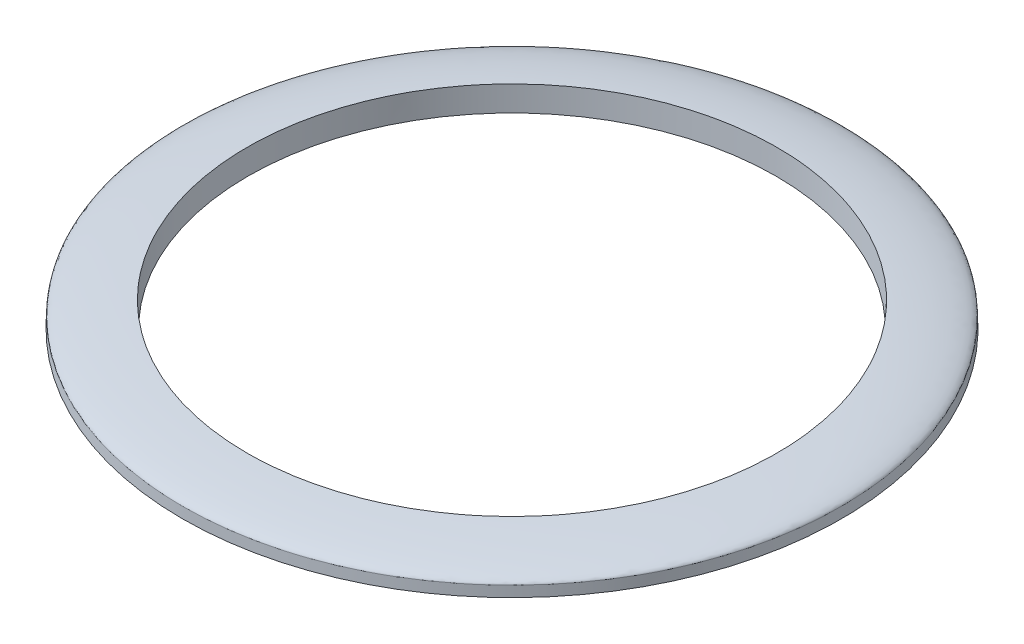
ISO-10303-21;
HEADER;
FILE_DESCRIPTION(('STEP AP214'),'2;1');
FILE_NAME('part.step','',(''),(''),'','','');
FILE_SCHEMA(('AUTOMOTIVE_DESIGN { 1 0 10303 214 1 1 1 1 }'));
ENDSEC;
DATA;
#1=APPLICATION_CONTEXT('core data for automotive mechanical design processes');
#2=APPLICATION_PROTOCOL_DEFINITION('international standard','automotive_design',2000,#1);
#3=PRODUCT_CONTEXT('',#1,'mechanical');
#4=PRODUCT('Part','Part','',(#3));
#5=PRODUCT_RELATED_PRODUCT_CATEGORY('part','',(#4));
#6=PRODUCT_DEFINITION_FORMATION('','',#4);
#7=PRODUCT_DEFINITION_CONTEXT('part definition',#1,'design');
#8=PRODUCT_DEFINITION('design','',#6,#7);
#9=PRODUCT_DEFINITION_SHAPE('','',#8);
#10=(LENGTH_UNIT() NAMED_UNIT(*) SI_UNIT(.MILLI.,.METRE.));
#11=(NAMED_UNIT(*) PLANE_ANGLE_UNIT() SI_UNIT($,.RADIAN.));
#12=(NAMED_UNIT(*) SI_UNIT($,.STERADIAN.) SOLID_ANGLE_UNIT());
#13=UNCERTAINTY_MEASURE_WITH_UNIT(LENGTH_MEASURE(1.E-05),#10,'distance_accuracy_value','');
#14=(GEOMETRIC_REPRESENTATION_CONTEXT(3) GLOBAL_UNCERTAINTY_ASSIGNED_CONTEXT((#13)) GLOBAL_UNIT_ASSIGNED_CONTEXT((#10,
#11,#12)) REPRESENTATION_CONTEXT('',''));
#15=CARTESIAN_POINT('',(0.,0.,0.));
#16=DIRECTION('',(0.,0.,1.));
#17=DIRECTION('',(1.,0.,0.));
#18=AXIS2_PLACEMENT_3D('',#15,#16,#17);
#19=CARTESIAN_POINT('',(0.,0.,0.));
#20=DIRECTION('',(0.,1.,0.));
#21=DIRECTION('',(0.,0.,1.));
#22=AXIS2_PLACEMENT_3D('',#19,#20,#21);
#23=PLANE('',#22);
#24=CARTESIAN_POINT('',(0.,0.,0.));
#25=DIRECTION('',(0.,1.,0.));
#26=DIRECTION('',(0.,0.,1.));
#27=AXIS2_PLACEMENT_3D('',#24,#25,#26);
#28=CIRCLE('',#27,20.12);
#29=CARTESIAN_POINT('',(0.,0.,20.12));
#30=VERTEX_POINT('',#29);
#31=EDGE_CURVE('E53',#30,#30,#28,.T.);
#32=ORIENTED_EDGE('',*,*,#31,.F.);
#33=EDGE_LOOP('',(#32));
#34=FACE_BOUND('',#33,.T.);
#35=CARTESIAN_POINT('',(0.,0.,0.));
#36=DIRECTION('',(0.,1.,0.));
#37=DIRECTION('',(0.,0.,1.));
#38=AXIS2_PLACEMENT_3D('',#35,#36,#37);
#39=CIRCLE('',#38,16.12);
#40=CARTESIAN_POINT('',(0.,0.,16.12));
#41=VERTEX_POINT('',#40);
#42=EDGE_CURVE('E63',#41,#41,#39,.T.);
#43=ORIENTED_EDGE('',*,*,#42,.T.);
#44=EDGE_LOOP('',(#43));
#45=FACE_BOUND('',#44,.T.);
#46=ADVANCED_FACE('F40',(#34,#45),#23,.F.);
#47=CARTESIAN_POINT('',(0.,0.,0.));
#48=DIRECTION('',(0.,-1.,0.));
#49=DIRECTION('',(0.,0.,1.));
#50=AXIS2_PLACEMENT_3D('',#47,#48,#49);
#51=CONICAL_SURFACE('',#50,20.12,0.0349065850398866);
#52=CARTESIAN_POINT('',(0.,0.642220226457298,20.097573175509));
#53=CARTESIAN_POINT('',(1.31538308755152,0.642220226457298,20.097573175509));
#54=CARTESIAN_POINT('',(2.63073365218901,0.642220226457225,19.9680224524914));
#55=CARTESIAN_POINT('',(5.21095039291647,0.642220226457371,19.4547854322406));
#56=CARTESIAN_POINT('',(6.47575277301016,0.642220226457353,19.0711118248205));
#57=CARTESIAN_POINT('',(8.90626379701449,0.642220226457244,18.0643611951806));
#58=CARTESIAN_POINT('',(10.0719123464086,0.642220226457214,17.4413090649246));
#59=CARTESIAN_POINT('',(12.2593144780834,0.642220226457383,15.9797336880004));
#60=CARTESIAN_POINT('',(13.2810139767288,0.642220226457298,15.1412465788617));
#61=CARTESIAN_POINT('',(15.1412465788617,0.642220226457298,13.2810139767288));
#62=CARTESIAN_POINT('',(15.9797336880004,0.642220226457383,12.2593144780834));
#63=CARTESIAN_POINT('',(17.4413090649246,0.642220226457214,10.0719123464086));
#64=CARTESIAN_POINT('',(18.0643611951811,0.642220226457248,8.90626379701345));
#65=CARTESIAN_POINT('',(19.0711118248201,0.642220226457348,6.47575277301118));
#66=CARTESIAN_POINT('',(19.4547854322406,0.642220226457431,5.2109503929167));
#67=CARTESIAN_POINT('',(19.9680224524914,0.642220226457165,2.63073365218881));
#68=CARTESIAN_POINT('',(20.097573175509,0.642220226457298,1.31538308755345));
#69=CARTESIAN_POINT('',(20.097573175509,0.642220226457298,-1.31538308755345));
#70=CARTESIAN_POINT('',(19.9680224524913,0.642220226457219,-2.63073365218922));
#71=CARTESIAN_POINT('',(19.4547854322407,0.642220226457377,-5.21095039291623));
#72=CARTESIAN_POINT('',(19.0711118248207,0.642220226457188,-6.47575277300977));
#73=CARTESIAN_POINT('',(18.0643611951805,0.642220226457409,-8.90626379701488));
#74=CARTESIAN_POINT('',(17.4413090649246,0.642220226457214,-10.0719123464086));
#75=CARTESIAN_POINT('',(15.9797336880004,0.642220226457383,-12.2593144780834));
#76=CARTESIAN_POINT('',(15.1412465788607,0.642220226457298,-13.2810139767297));
#77=CARTESIAN_POINT('',(13.2810139767297,0.642220226457298,-15.1412465788608));
#78=CARTESIAN_POINT('',(12.2593144780834,0.642220226457382,-15.9797336880004));
#79=CARTESIAN_POINT('',(10.0719123464087,0.642220226457214,-17.4413090649246));
#80=CARTESIAN_POINT('',(8.90626379701373,0.64222022645737,-18.0643611951809));
#81=CARTESIAN_POINT('',(6.47575277301097,0.642220226457227,-19.0711118248202));
#82=CARTESIAN_POINT('',(5.21095039291749,0.64222022645749,-19.4547854322404));
#83=CARTESIAN_POINT('',(2.63073365218802,0.642220226457106,-19.9680224524916));
#84=CARTESIAN_POINT('',(1.31538308755345,0.642220226457298,-20.097573175509));
#85=CARTESIAN_POINT('',(-1.31538308755345,0.642220226457298,-20.097573175509));
#86=CARTESIAN_POINT('',(-2.63073365218922,0.642220226457162,-19.9680224524913));
#87=CARTESIAN_POINT('',(-5.21095039291623,0.642220226457434,-19.4547854322407));
#88=CARTESIAN_POINT('',(-6.47575277301013,0.642220226457295,-19.0711118248206));
#89=CARTESIAN_POINT('',(-8.90626379701446,0.642220226457301,-18.0643611951806));
#90=CARTESIAN_POINT('',(-10.0719123464091,0.642220226457125,-17.4413090649243));
#91=CARTESIAN_POINT('',(-12.259314478083,0.642220226457471,-15.9797336880006));
#92=CARTESIAN_POINT('',(-13.2810139767279,0.642220226457481,-15.1412465788626));
#93=CARTESIAN_POINT('',(-15.1412465788626,0.642220226457115,-13.2810139767279));
#94=CARTESIAN_POINT('',(-15.979733688001,0.642220226457286,-12.2593144780824));
#95=CARTESIAN_POINT('',(-17.4413090649239,0.64222022645731,-10.0719123464097));
#96=CARTESIAN_POINT('',(-18.0643611951809,0.642220226457297,-8.90626379701385));
#97=CARTESIAN_POINT('',(-19.0711118248203,0.642220226457299,-6.47575277301084));
#98=CARTESIAN_POINT('',(-19.4547854322404,0.642220226457424,-5.21095039291767));
#99=CARTESIAN_POINT('',(-19.9680224524916,0.642220226457172,-2.63073365218786));
#100=CARTESIAN_POINT('',(-20.097573175509,0.642220226457298,-1.31538308755342));
#101=CARTESIAN_POINT('',(-20.0975731755089,0.642220226457298,1.31538308755348));
#102=CARTESIAN_POINT('',(-19.9680224524914,0.642220226457166,2.6307336521887));
#103=CARTESIAN_POINT('',(-19.4547854322406,0.64222022645743,5.21095039291675));
#104=CARTESIAN_POINT('',(-19.071111824821,0.642220226457373,6.47575277300897));
#105=CARTESIAN_POINT('',(-18.0643611951802,0.642220226457224,8.90626379701561));
#106=CARTESIAN_POINT('',(-17.4413090649249,0.64222022645716,10.0719123464082));
#107=CARTESIAN_POINT('',(-15.9797336880001,0.642220226457436,12.2593144780838));
#108=CARTESIAN_POINT('',(-15.141246578862,0.642220226457184,13.2810139767285));
#109=CARTESIAN_POINT('',(-13.2810139767286,0.642220226457412,15.1412465788619));
#110=CARTESIAN_POINT('',(-12.2593144780824,0.642220226457229,15.979733688001));
#111=CARTESIAN_POINT('',(-10.0719123464097,0.642220226457367,17.4413090649239));
#112=CARTESIAN_POINT('',(-8.90626379701346,0.642220226457303,18.0643611951811));
#113=CARTESIAN_POINT('',(-6.47575277301124,0.642220226457293,19.0711118248201));
#114=CARTESIAN_POINT('',(-5.21095039291724,0.642220226457427,19.4547854322405));
#115=CARTESIAN_POINT('',(-2.6307336521883,0.642220226457169,19.9680224524915));
#116=CARTESIAN_POINT('',(-1.31538308755153,0.642220226457298,20.097573175509));
#117=CARTESIAN_POINT('',(0.,0.642220226457298,20.097573175509));
#118=(BOUNDED_CURVE() B_SPLINE_CURVE(3,(#52,#53,#54,#55,#56,#57,#58,#59,#60,#61,#62,#63,#64,#65,
#66,#67,#68,#69,#70,#71,#72,#73,#74,#75,#76,#77,#78,#79,#80,#81,#82,#83,#84,#85,#86,#87,#88,#89,
#90,#91,#92,#93,#94,#95,#96,#97,#98,#99,#100,#101,#102,#103,#104,#105,#106,#107,#108,#109,#110,
#111,#112,#113,#114,#115,#116,#117),.UNSPECIFIED.,.T.,.F.) B_SPLINE_CURVE_WITH_KNOTS((4,2,2,2,2,
2,2,2,2,2,2,2,2,2,2,2,2,2,2,2,2,2,2,2,2,2,2,2,2,2,2,2,4),(0.,0.196349540849362,
0.392699081698724,0.589048622548086,0.785398163397448,0.98174770424681,1.17809724509617,
1.37444678594553,1.5707963267949,1.76714586764426,1.96349540849362,2.15984494934298,
2.35619449019234,2.55254403104171,2.74889357189107,2.94524311274043,3.14159265358979,
3.33794219443916,3.53429173528852,3.73064127613788,3.92699081698724,4.1233403578366,
4.31968989868597,4.51603943953533,4.71238898038469,4.90873852123405,5.10508806208341,
5.30143760293278,5.49778714378214,5.6941366846315,5.89048622548086,6.08683576633022,
6.28318530717959),
.UNSPECIFIED.) CURVE() GEOMETRIC_REPRESENTATION_ITEM() RATIONAL_B_SPLINE_CURVE((1.,1.,1.,1.,1.,
1.,1.,1.,1.,1.,1.,1.,1.,1.,1.,1.,1.,1.,1.,1.,1.,1.,1.,1.,1.,1.,1.,1.,1.,1.,1.,1.,1.,1.,1.,1.,1.,
1.,1.,1.,1.,1.,1.,1.,1.,1.,1.,1.,1.,1.,1.,1.,1.,1.,1.,1.,1.,1.,1.,1.,1.,1.,1.,1.,1.,1.)) REPRESENTATION_ITEM(''));
#119=CARTESIAN_POINT('',(0.,0.642220226457298,20.097573175509));
#120=VERTEX_POINT('',#119);
#121=EDGE_CURVE('E11',#120,#120,#118,.F.);
#122=ORIENTED_EDGE('',*,*,#121,.T.);
#123=EDGE_LOOP('',(#122));
#124=FACE_BOUND('',#123,.T.);
#125=ORIENTED_EDGE('',*,*,#31,.T.);
#126=EDGE_LOOP('',(#125));
#127=FACE_BOUND('',#126,.T.);
#128=ADVANCED_FACE('F72',(#124,#127),#51,.T.);
#129=CARTESIAN_POINT('',(0.,0.,0.));
#130=DIRECTION('',(0.,1.,0.));
#131=DIRECTION('',(0.,0.,1.));
#132=AXIS2_PLACEMENT_3D('',#129,#130,#131);
#133=CONICAL_SURFACE('',#132,16.12,0.0349065850398866);
#134=CARTESIAN_POINT('',(0.,1.5,16.1723811542376));
#135=CARTESIAN_POINT('',(-1.05847987067635,1.5,16.1723811542376));
#136=CARTESIAN_POINT('',(-2.11693357038287,1.5,16.068132563965));
#137=CARTESIAN_POINT('',(-4.19321652391273,1.5,15.6551342063287));
#138=CARTESIAN_POINT('',(-5.21099444152664,1.49999999999977,15.3463946503722));
#139=CARTESIAN_POINT('',(-7.16681021771369,1.50000000000023,14.5362692303706));
#140=CARTESIAN_POINT('',(-8.10479971863917,1.50000000000023,14.0349033967212));
#141=CARTESIAN_POINT('',(-9.86498741404409,1.49999999999977,12.8587835799247));
#142=CARTESIAN_POINT('',(-10.6871420877892,1.50000000000023,12.1840586763998));
#143=CARTESIAN_POINT('',(-12.1840586764008,1.49999999999977,10.68714208779));
#144=CARTESIAN_POINT('',(-12.8587835799229,1.50000000000011,9.86498741404407));
#145=CARTESIAN_POINT('',(-14.034903396723,1.49999999999989,8.10479971863915));
#146=CARTESIAN_POINT('',(-14.5362692303697,1.5,7.16681021771455));
#147=CARTESIAN_POINT('',(-15.3463946503731,1.5,5.21099444152568));
#148=CARTESIAN_POINT('',(-15.6551342063288,1.5,4.19321652391201));
#149=CARTESIAN_POINT('',(-16.068132563965,1.5,2.11693357038352));
#150=CARTESIAN_POINT('',(-16.1723811542376,1.5,1.05847987067792));
#151=CARTESIAN_POINT('',(-16.1723811542376,1.5,-1.05847987067787));
#152=CARTESIAN_POINT('',(-16.068132563965,1.5,-2.11693357038264));
#153=CARTESIAN_POINT('',(-15.6551342063287,1.5,-4.19321652391296));
#154=CARTESIAN_POINT('',(-15.3463946503722,1.49999999999977,-5.21099444152619));
#155=CARTESIAN_POINT('',(-14.5362692303706,1.50000000000023,-7.16681021771414));
#156=CARTESIAN_POINT('',(-14.0349033967221,1.49999999999989,-8.104799718641));
#157=CARTESIAN_POINT('',(-12.8587835799238,1.50000000000011,-9.86498741404227));
#158=CARTESIAN_POINT('',(-12.1840586764009,1.49999999999966,-10.6871420877899));
#159=CARTESIAN_POINT('',(-10.687142087789,1.50000000000034,-12.1840586764));
#160=CARTESIAN_POINT('',(-9.86498741404326,1.50000000000011,-12.8587835799234));
#161=CARTESIAN_POINT('',(-8.10479971863996,1.49999999999989,-14.0349033967225));
#162=CARTESIAN_POINT('',(-7.16681021771442,1.5,-14.5362692303717));
#163=CARTESIAN_POINT('',(-5.21099444152583,1.5,-15.3463946503711));
#164=CARTESIAN_POINT('',(-4.19321652391144,1.50000000000023,-15.6551342063266));
#165=CARTESIAN_POINT('',(-2.11693357038409,1.49999999999977,-16.0681325639672));
#166=CARTESIAN_POINT('',(-1.0584798706779,1.5,-16.1723811542376));
#167=CARTESIAN_POINT('',(1.0584798706779,1.5,-16.1723811542376));
#168=CARTESIAN_POINT('',(2.11693357038321,1.5,-16.0681325639653));
#169=CARTESIAN_POINT('',(4.19321652391238,1.5,-15.6551342063284));
#170=CARTESIAN_POINT('',(5.21099444152587,1.50000000000011,-15.3463946503702));
#171=CARTESIAN_POINT('',(7.16681021771446,1.49999999999989,-14.5362692303726));
#172=CARTESIAN_POINT('',(8.10479971863998,1.49999999999989,-14.0349033967215));
#173=CARTESIAN_POINT('',(9.86498741404328,1.50000000000011,-12.8587835799243));
#174=CARTESIAN_POINT('',(10.6871420877899,1.5,-12.1840586764));
#175=CARTESIAN_POINT('',(12.1840586764,1.5,-10.6871420877899));
#176=CARTESIAN_POINT('',(12.8587835799243,1.50000000000011,-9.86498741404418));
#177=CARTESIAN_POINT('',(14.0349033967216,1.49999999999989,-8.10479971863904));
#178=CARTESIAN_POINT('',(14.5362692303717,1.50000000000011,-7.16681021771491));
#179=CARTESIAN_POINT('',(15.3463946503711,1.49999999999989,-5.2109944415254));
#180=CARTESIAN_POINT('',(15.6551342063284,1.50000000000011,-4.1932165239119));
#181=CARTESIAN_POINT('',(16.0681325639653,1.49999999999989,-2.11693357038364));
#182=CARTESIAN_POINT('',(16.1723811542376,1.5,-1.0584798706779));
#183=CARTESIAN_POINT('',(16.1723811542376,1.5,1.0584798706779));
#184=CARTESIAN_POINT('',(16.0681325639653,1.49999999999989,2.11693357038366));
#185=CARTESIAN_POINT('',(15.6551342063284,1.50000000000011,4.19321652391192));
#186=CARTESIAN_POINT('',(15.3463946503711,1.5,5.21099444152584));
#187=CARTESIAN_POINT('',(14.5362692303717,1.5,7.16681021771444));
#188=CARTESIAN_POINT('',(14.0349033967234,1.49999999999977,8.10479971863996));
#189=CARTESIAN_POINT('',(12.8587835799225,1.50000000000023,9.86498741404327));
#190=CARTESIAN_POINT('',(12.1840586764,1.5,10.6871420877899));
#191=CARTESIAN_POINT('',(10.6871420877899,1.5,12.1840586764));
#192=CARTESIAN_POINT('',(9.86498741404419,1.50000000000011,12.8587835799243));
#193=CARTESIAN_POINT('',(8.10479971863905,1.49999999999989,14.0349033967215));
#194=CARTESIAN_POINT('',(7.1668102177149,1.5,14.5362692303708));
#195=CARTESIAN_POINT('',(5.21099444152539,1.5,15.346394650372));
#196=CARTESIAN_POINT('',(4.19321652391192,1.50000000000011,15.6551342063283));
#197=CARTESIAN_POINT('',(2.11693357038364,1.49999999999989,16.0681325639654));
#198=CARTESIAN_POINT('',(1.05847987067635,1.5,16.1723811542376));
#199=CARTESIAN_POINT('',(0.,1.5,16.1723811542376));
#200=(BOUNDED_CURVE() B_SPLINE_CURVE(3,(#134,#135,#136,#137,#138,#139,#140,#141,#142,#143,#144,
#145,#146,#147,#148,#149,#150,#151,#152,#153,#154,#155,#156,#157,#158,#159,#160,#161,#162,#163,
#164,#165,#166,#167,#168,#169,#170,#171,#172,#173,#174,#175,#176,#177,#178,#179,#180,#181,#182,
#183,#184,#185,#186,#187,#188,#189,#190,#191,#192,#193,#194,#195,#196,#197,#198,#199),
.UNSPECIFIED.,.T.,.F.) B_SPLINE_CURVE_WITH_KNOTS((4,2,2,2,2,2,2,2,2,2,2,2,2,2,2,2,2,2,2,2,2,2,2,
2,2,2,2,2,2,2,2,2,4),(0.,0.196349540849362,0.392699081698725,0.589048622548086,
0.785398163397448,0.981747704246811,1.17809724509617,1.37444678594553,1.5707963267949,
1.76714586764426,1.96349540849362,2.15984494934298,2.35619449019234,2.55254403104171,
2.74889357189107,2.94524311274043,3.14159265358979,3.33794219443916,3.53429173528852,
3.73064127613788,3.92699081698724,4.1233403578366,4.31968989868597,4.51603943953533,
4.71238898038469,4.90873852123405,5.10508806208341,5.30143760293278,5.49778714378214,
5.6941366846315,5.89048622548086,6.08683576633022,6.28318530717959),
.UNSPECIFIED.) CURVE() GEOMETRIC_REPRESENTATION_ITEM() RATIONAL_B_SPLINE_CURVE((1.,1.,1.,1.,1.,
1.,1.,1.,1.,1.,1.,1.,1.,1.,1.,1.,1.,1.,1.,1.,1.,1.,1.,1.,1.,1.,1.,1.,1.,1.,1.,1.,1.,1.,1.,1.,1.,
1.,1.,1.,1.,1.,1.,1.,1.,1.,1.,1.,1.,1.,1.,1.,1.,1.,1.,1.,1.,1.,1.,1.,1.,1.,1.,1.,1.,1.)) REPRESENTATION_ITEM(''));
#201=CARTESIAN_POINT('',(0.,1.5,16.1723811542376));
#202=VERTEX_POINT('',#201);
#203=EDGE_CURVE('E58',#202,#202,#200,.F.);
#204=ORIENTED_EDGE('',*,*,#203,.T.);
#205=EDGE_LOOP('',(#204));
#206=FACE_BOUND('',#205,.T.);
#207=ORIENTED_EDGE('',*,*,#42,.F.);
#208=EDGE_LOOP('',(#207));
#209=FACE_BOUND('',#208,.T.);
#210=ADVANCED_FACE('F81',(#206,#209),#133,.F.);
#211=CARTESIAN_POINT('',(0.,1.5,16.1723811542376));
#212=CARTESIAN_POINT('',(1.05847987067635,1.5,16.1723811542376));
#213=CARTESIAN_POINT('',(2.11693357038364,1.49999999999989,16.0681325639654));
#214=CARTESIAN_POINT('',(4.19321652391192,1.50000000000011,15.6551342063283));
#215=CARTESIAN_POINT('',(5.21099444152539,1.5,15.346394650372));
#216=CARTESIAN_POINT('',(7.1668102177149,1.5,14.5362692303708));
#217=CARTESIAN_POINT('',(8.10479971863905,1.49999999999989,14.0349033967215));
#218=CARTESIAN_POINT('',(9.86498741404419,1.50000000000011,12.8587835799243));
#219=CARTESIAN_POINT('',(10.6871420877899,1.5,12.1840586764));
#220=CARTESIAN_POINT('',(12.1840586764,1.5,10.6871420877899));
#221=CARTESIAN_POINT('',(12.8587835799225,1.50000000000023,9.86498741404327));
#222=CARTESIAN_POINT('',(14.0349033967234,1.49999999999977,8.10479971863996));
#223=CARTESIAN_POINT('',(14.5362692303717,1.5,7.16681021771444));
#224=CARTESIAN_POINT('',(15.3463946503711,1.5,5.21099444152584));
#225=CARTESIAN_POINT('',(15.6551342063284,1.50000000000011,4.19321652391192));
#226=CARTESIAN_POINT('',(16.0681325639653,1.49999999999989,2.11693357038366));
#227=CARTESIAN_POINT('',(16.1723811542376,1.5,1.0584798706779));
#228=CARTESIAN_POINT('',(16.1723811542376,1.5,-1.0584798706779));
#229=CARTESIAN_POINT('',(16.0681325639653,1.49999999999989,-2.11693357038364));
#230=CARTESIAN_POINT('',(15.6551342063284,1.50000000000011,-4.1932165239119));
#231=CARTESIAN_POINT('',(15.3463946503711,1.49999999999989,-5.2109944415254));
#232=CARTESIAN_POINT('',(14.5362692303717,1.50000000000011,-7.16681021771491));
#233=CARTESIAN_POINT('',(14.0349033967216,1.49999999999989,-8.10479971863904));
#234=CARTESIAN_POINT('',(12.8587835799243,1.50000000000011,-9.86498741404418));
#235=CARTESIAN_POINT('',(12.1840586764,1.5,-10.6871420877899));
#236=CARTESIAN_POINT('',(10.6871420877899,1.5,-12.1840586764));
#237=CARTESIAN_POINT('',(9.86498741404328,1.50000000000011,-12.8587835799243));
#238=CARTESIAN_POINT('',(8.10479971863998,1.49999999999989,-14.0349033967215));
#239=CARTESIAN_POINT('',(7.16681021771446,1.49999999999989,-14.5362692303726));
#240=CARTESIAN_POINT('',(5.21099444152587,1.50000000000011,-15.3463946503702));
#241=CARTESIAN_POINT('',(4.19321652391238,1.5,-15.6551342063284));
#242=CARTESIAN_POINT('',(2.11693357038321,1.5,-16.0681325639653));
#243=CARTESIAN_POINT('',(1.0584798706779,1.5,-16.1723811542376));
#244=CARTESIAN_POINT('',(-1.0584798706779,1.5,-16.1723811542376));
#245=CARTESIAN_POINT('',(-2.11693357038409,1.49999999999977,-16.0681325639672));
#246=CARTESIAN_POINT('',(-4.19321652391144,1.50000000000023,-15.6551342063266));
#247=CARTESIAN_POINT('',(-5.21099444152583,1.5,-15.3463946503711));
#248=CARTESIAN_POINT('',(-7.16681021771442,1.5,-14.5362692303717));
#249=CARTESIAN_POINT('',(-8.10479971863996,1.49999999999989,-14.0349033967225));
#250=CARTESIAN_POINT('',(-9.86498741404326,1.50000000000011,-12.8587835799234));
#251=CARTESIAN_POINT('',(-10.687142087789,1.50000000000034,-12.1840586764));
#252=CARTESIAN_POINT('',(-12.1840586764009,1.49999999999966,-10.6871420877899));
#253=CARTESIAN_POINT('',(-12.8587835799238,1.50000000000011,-9.86498741404227));
#254=CARTESIAN_POINT('',(-14.0349033967221,1.49999999999989,-8.104799718641));
#255=CARTESIAN_POINT('',(-14.5362692303706,1.50000000000023,-7.16681021771414));
#256=CARTESIAN_POINT('',(-15.3463946503722,1.49999999999977,-5.21099444152619));
#257=CARTESIAN_POINT('',(-15.6551342063287,1.5,-4.19321652391296));
#258=CARTESIAN_POINT('',(-16.068132563965,1.5,-2.11693357038264));
#259=CARTESIAN_POINT('',(-16.1723811542376,1.5,-1.05847987067787));
#260=CARTESIAN_POINT('',(-16.1723811542376,1.5,1.05847987067792));
#261=CARTESIAN_POINT('',(-16.068132563965,1.5,2.11693357038352));
#262=CARTESIAN_POINT('',(-15.6551342063288,1.5,4.19321652391201));
#263=CARTESIAN_POINT('',(-15.3463946503731,1.5,5.21099444152568));
#264=CARTESIAN_POINT('',(-14.5362692303697,1.5,7.16681021771455));
#265=CARTESIAN_POINT('',(-14.034903396723,1.49999999999989,8.10479971863915));
#266=CARTESIAN_POINT('',(-12.8587835799229,1.50000000000011,9.86498741404407));
#267=CARTESIAN_POINT('',(-12.1840586764008,1.49999999999977,10.68714208779));
#268=CARTESIAN_POINT('',(-10.6871420877892,1.50000000000023,12.1840586763998));
#269=CARTESIAN_POINT('',(-9.86498741404409,1.49999999999977,12.8587835799247));
#270=CARTESIAN_POINT('',(-8.10479971863917,1.50000000000023,14.0349033967212));
#271=CARTESIAN_POINT('',(-7.16681021771369,1.50000000000023,14.5362692303706));
#272=CARTESIAN_POINT('',(-5.21099444152664,1.49999999999977,15.3463946503722));
#273=CARTESIAN_POINT('',(-4.19321652391273,1.5,15.6551342063287));
#274=CARTESIAN_POINT('',(-2.11693357038287,1.5,16.068132563965));
#275=CARTESIAN_POINT('',(-1.05847987067635,1.5,16.1723811542376));
#276=CARTESIAN_POINT('',(0.,1.5,16.1723811542376));
#277=CARTESIAN_POINT('',(0.,1.21663746026411,20.0775140836951));
#278=CARTESIAN_POINT('',(1.3140702230632,1.21663746026411,20.0775140836951));
#279=CARTESIAN_POINT('',(2.62810795567249,1.21663746026102,19.9480926633463));
#280=CARTESIAN_POINT('',(5.20574942007036,1.21663746026719,19.4353678974071));
#281=CARTESIAN_POINT('',(6.46928941953473,1.21663746026344,19.0520772289634));
#282=CARTESIAN_POINT('',(8.89737458627901,1.21663746026481,18.0463314223026));
#283=CARTESIAN_POINT('',(10.0618597190219,1.21663746026161,17.4239011511995));
#284=CARTESIAN_POINT('',(12.2470786368438,1.21663746026663,15.9637845511382));
#285=CARTESIAN_POINT('',(13.2677583922657,1.21663746026412,15.1261343236328));
#286=CARTESIAN_POINT('',(15.1261343236328,1.21663746026412,13.2677583922657));
#287=CARTESIAN_POINT('',(15.9637845511364,1.21663746027166,12.2470786368429));
#288=CARTESIAN_POINT('',(17.4239011512013,1.21663746025658,10.0618597190228));
#289=CARTESIAN_POINT('',(18.0463314223044,1.21663746026458,8.897374586279));
#290=CARTESIAN_POINT('',(19.0520772289616,1.21663746026366,6.46928941953473));
#291=CARTESIAN_POINT('',(19.4353678974054,1.21663746026707,5.20574942007025));
#292=CARTESIAN_POINT('',(19.948092663348,1.21663746026113,2.62810795567263));
#293=CARTESIAN_POINT('',(20.0775140836951,1.21663746026411,1.31407022306513));
#294=CARTESIAN_POINT('',(20.0775140836951,1.21663746026411,-1.31407022306512));
#295=CARTESIAN_POINT('',(19.948092663348,1.21663746026092,-2.62810795567306));
#296=CARTESIAN_POINT('',(19.4353678974054,1.21663746026731,-5.20574942006977));
#297=CARTESIAN_POINT('',(19.0520772289634,1.21663746026332,-6.46928941953383));
#298=CARTESIAN_POINT('',(18.0463314223026,1.21663746026492,-8.89737458627992));
#299=CARTESIAN_POINT('',(17.4239011512013,1.21663746026161,-10.0618597190219));
#300=CARTESIAN_POINT('',(15.9637845511364,1.21663746026663,-12.2470786368438));
#301=CARTESIAN_POINT('',(15.1261343236318,1.21663746026412,-13.2677583922666));
#302=CARTESIAN_POINT('',(13.2677583922666,1.21663746026412,-15.1261343236319));
#303=CARTESIAN_POINT('',(12.2470786368438,1.21663746026662,-15.9637845511382));
#304=CARTESIAN_POINT('',(10.0618597190219,1.21663746026159,-17.4239011511995));
#305=CARTESIAN_POINT('',(8.89737458627857,1.21663746025681,-18.0463314223026));
#306=CARTESIAN_POINT('',(6.46928941953522,1.21663746027143,-19.0520772289634));
#307=CARTESIAN_POINT('',(5.20574942007025,1.21663746025999,-19.4353678974036));
#308=CARTESIAN_POINT('',(2.62810795567263,1.21663746026821,-19.9480926633498));
#309=CARTESIAN_POINT('',(1.31407022306513,1.21663746026411,-20.0775140836951));
#310=CARTESIAN_POINT('',(-1.31407022306512,1.21663746026411,-20.0775140836951));
#311=CARTESIAN_POINT('',(-2.62810795567305,1.2166374602536,-19.948092663348));
#312=CARTESIAN_POINT('',(-5.20574942006976,1.21663746027462,-19.4353678974054));
#313=CARTESIAN_POINT('',(-6.46928941953471,1.21663746026344,-19.0520772289634));
#314=CARTESIAN_POINT('',(-8.89737458627898,1.21663746026481,-18.0463314223026));
#315=CARTESIAN_POINT('',(-10.0618597190237,1.21663746026161,-17.4239011512031));
#316=CARTESIAN_POINT('',(-12.2470786368419,1.21663746026663,-15.9637845511346));
#317=CARTESIAN_POINT('',(-13.2677583922648,1.21663746027189,-15.1261343236346));
#318=CARTESIAN_POINT('',(-15.1261343236337,1.21663746025635,-13.2677583922638));
#319=CARTESIAN_POINT('',(-15.9637845511385,1.21663746027153,-12.2470786368416));
#320=CARTESIAN_POINT('',(-17.4239011511992,1.21663746025668,-10.0618597190241));
#321=CARTESIAN_POINT('',(-18.0463314223027,1.21663746027303,-8.89737458627948));
#322=CARTESIAN_POINT('',(-19.0520772289633,1.21663746025521,-6.4692894195343));
#323=CARTESIAN_POINT('',(-19.4353678974054,1.21663746025966,-5.20574942007125));
#324=CARTESIAN_POINT('',(-19.948092663348,1.21663746026857,-2.62810795567165));
#325=CARTESIAN_POINT('',(-20.0775140836951,1.21663746026411,-1.31407022306509));
#326=CARTESIAN_POINT('',(-20.0775140836951,1.21663746026411,1.31407022306516));
#327=CARTESIAN_POINT('',(-19.948092663348,1.21663746026857,2.62810795567252));
#328=CARTESIAN_POINT('',(-19.4353678974054,1.21663746025966,5.2057494200703));
#329=CARTESIAN_POINT('',(-19.0520772289634,1.21663746025567,6.46928941953334));
#330=CARTESIAN_POINT('',(-18.0463314223027,1.21663746027258,8.89737458628034));
#331=CARTESIAN_POINT('',(-17.4239011512029,1.21663746026161,10.0618597190232));
#332=CARTESIAN_POINT('',(-15.9637845511348,1.21663746026663,12.2470786368425));
#333=CARTESIAN_POINT('',(-15.126134323634,1.21663746025624,13.2677583922654));
#334=CARTESIAN_POINT('',(-13.2677583922645,1.216637460272,15.126134323633));
#335=CARTESIAN_POINT('',(-12.2470786368416,1.21663746026149,15.9637845511367));
#336=CARTESIAN_POINT('',(-10.0618597190241,1.21663746026675,17.423901151201));
#337=CARTESIAN_POINT('',(-8.89737458627857,1.21663746027292,18.0463314223027));
#338=CARTESIAN_POINT('',(-6.46928941953522,1.21663746025532,19.0520772289633));
#339=CARTESIAN_POINT('',(-5.20574942007034,1.21663746025966,19.4353678974054));
#340=CARTESIAN_POINT('',(-2.62810795567256,1.21663746026857,19.948092663348));
#341=CARTESIAN_POINT('',(-1.3140702230632,1.21663746026411,20.0775140836951));
#342=CARTESIAN_POINT('',(0.,1.21663746026411,20.0775140836951));
#343=CARTESIAN_POINT('',(0.,0.642220226457298,20.0975731755089));
#344=CARTESIAN_POINT('',(1.31538308755152,0.642220226457298,20.0975731755089));
#345=CARTESIAN_POINT('',(2.63073365218901,0.642220226457224,19.9680224524914));
#346=CARTESIAN_POINT('',(5.21095039291647,0.642220226457371,19.4547854322406));
#347=CARTESIAN_POINT('',(6.47575277301016,0.642220226457352,19.0711118248205));
#348=CARTESIAN_POINT('',(8.90626379701449,0.642220226457243,18.0643611951806));
#349=CARTESIAN_POINT('',(10.0719123464086,0.642220226457214,17.4413090649246));
#350=CARTESIAN_POINT('',(12.2593144780834,0.642220226457382,15.9797336880004));
#351=CARTESIAN_POINT('',(13.2810139767288,0.642220226457298,15.1412465788617));
#352=CARTESIAN_POINT('',(15.1412465788617,0.642220226457298,13.2810139767288));
#353=CARTESIAN_POINT('',(15.9797336880004,0.642220226457382,12.2593144780834));
#354=CARTESIAN_POINT('',(17.4413090649246,0.642220226457214,10.0719123464086));
#355=CARTESIAN_POINT('',(18.0643611951811,0.642220226457247,8.90626379701345));
#356=CARTESIAN_POINT('',(19.0711118248201,0.642220226457348,6.47575277301118));
#357=CARTESIAN_POINT('',(19.4547854322406,0.64222022645743,5.2109503929167));
#358=CARTESIAN_POINT('',(19.9680224524914,0.642220226457165,2.63073365218881));
#359=CARTESIAN_POINT('',(20.0975731755089,0.642220226457298,1.31538308755345));
#360=CARTESIAN_POINT('',(20.0975731755089,0.642220226457298,-1.31538308755345));
#361=CARTESIAN_POINT('',(19.9680224524913,0.642220226457219,-2.63073365218922));
#362=CARTESIAN_POINT('',(19.4547854322407,0.642220226457376,-5.21095039291623));
#363=CARTESIAN_POINT('',(19.0711118248207,0.642220226457187,-6.47575277300977));
#364=CARTESIAN_POINT('',(18.0643611951805,0.642220226457408,-8.90626379701488));
#365=CARTESIAN_POINT('',(17.4413090649246,0.642220226457214,-10.0719123464086));
#366=CARTESIAN_POINT('',(15.9797336880004,0.642220226457382,-12.2593144780834));
#367=CARTESIAN_POINT('',(15.1412465788607,0.642220226457298,-13.2810139767297));
#368=CARTESIAN_POINT('',(13.2810139767297,0.642220226457298,-15.1412465788608));
#369=CARTESIAN_POINT('',(12.2593144780834,0.642220226457382,-15.9797336880003));
#370=CARTESIAN_POINT('',(10.0719123464087,0.642220226457214,-17.4413090649246));
#371=CARTESIAN_POINT('',(8.90626379701373,0.64222022645737,-18.0643611951809));
#372=CARTESIAN_POINT('',(6.47575277301097,0.642220226457226,-19.0711118248202));
#373=CARTESIAN_POINT('',(5.21095039291749,0.64222022645749,-19.4547854322404));
#374=CARTESIAN_POINT('',(2.63073365218802,0.642220226457106,-19.9680224524916));
#375=CARTESIAN_POINT('',(1.31538308755345,0.642220226457298,-20.0975731755089));
#376=CARTESIAN_POINT('',(-1.31538308755345,0.642220226457298,-20.0975731755089));
#377=CARTESIAN_POINT('',(-2.63073365218922,0.642220226457162,-19.9680224524913));
#378=CARTESIAN_POINT('',(-5.21095039291623,0.642220226457433,-19.4547854322407));
#379=CARTESIAN_POINT('',(-6.47575277301013,0.642220226457295,-19.0711118248206));
#380=CARTESIAN_POINT('',(-8.90626379701446,0.6422202264573,-18.0643611951806));
#381=CARTESIAN_POINT('',(-10.0719123464091,0.642220226457125,-17.4413090649243));
#382=CARTESIAN_POINT('',(-12.259314478083,0.64222022645747,-15.9797336880006));
#383=CARTESIAN_POINT('',(-13.2810139767279,0.642220226457481,-15.1412465788626));
#384=CARTESIAN_POINT('',(-15.1412465788626,0.642220226457114,-13.2810139767279));
#385=CARTESIAN_POINT('',(-15.979733688001,0.642220226457286,-12.2593144780824));
#386=CARTESIAN_POINT('',(-17.4413090649239,0.64222022645731,-10.0719123464097));
#387=CARTESIAN_POINT('',(-18.0643611951809,0.642220226457296,-8.90626379701385));
#388=CARTESIAN_POINT('',(-19.0711118248203,0.642220226457299,-6.47575277301084));
#389=CARTESIAN_POINT('',(-19.4547854322404,0.642220226457424,-5.21095039291767));
#390=CARTESIAN_POINT('',(-19.9680224524916,0.642220226457172,-2.63073365218786));
#391=CARTESIAN_POINT('',(-20.097573175509,0.642220226457298,-1.31538308755342));
#392=CARTESIAN_POINT('',(-20.0975731755089,0.642220226457298,1.31538308755348));
#393=CARTESIAN_POINT('',(-19.9680224524914,0.642220226457165,2.6307336521887));
#394=CARTESIAN_POINT('',(-19.4547854322406,0.64222022645743,5.21095039291675));
#395=CARTESIAN_POINT('',(-19.071111824821,0.642220226457373,6.47575277300897));
#396=CARTESIAN_POINT('',(-18.0643611951802,0.642220226457223,8.90626379701561));
#397=CARTESIAN_POINT('',(-17.4413090649249,0.64222022645716,10.0719123464082));
#398=CARTESIAN_POINT('',(-15.9797336880001,0.642220226457436,12.2593144780838));
#399=CARTESIAN_POINT('',(-15.141246578862,0.642220226457183,13.2810139767285));
#400=CARTESIAN_POINT('',(-13.2810139767286,0.642220226457412,15.1412465788619));
#401=CARTESIAN_POINT('',(-12.2593144780824,0.642220226457229,15.979733688001));
#402=CARTESIAN_POINT('',(-10.0719123464097,0.642220226457367,17.4413090649239));
#403=CARTESIAN_POINT('',(-8.90626379701346,0.642220226457303,18.0643611951811));
#404=CARTESIAN_POINT('',(-6.47575277301124,0.642220226457293,19.0711118248201));
#405=CARTESIAN_POINT('',(-5.21095039291723,0.642220226457427,19.4547854322405));
#406=CARTESIAN_POINT('',(-2.6307336521883,0.642220226457169,19.9680224524915));
#407=CARTESIAN_POINT('',(-1.31538308755153,0.642220226457298,20.0975731755089));
#408=CARTESIAN_POINT('',(0.,0.642220226457298,20.0975731755089));
#409=(BOUNDED_SURFACE() B_SPLINE_SURFACE(2,3,((#211,#212,#213,#214,#215,#216,#217,#218,#219,
#220,#221,#222,#223,#224,#225,#226,#227,#228,#229,#230,#231,#232,#233,#234,#235,#236,#237,#238,
#239,#240,#241,#242,#243,#244,#245,#246,#247,#248,#249,#250,#251,#252,#253,#254,#255,#256,#257,
#258,#259,#260,#261,#262,#263,#264,#265,#266,#267,#268,#269,#270,#271,#272,#273,#274,#275,#276),
(#277,#278,#279,#280,#281,#282,#283,#284,#285,#286,#287,#288,#289,#290,#291,#292,#293,#294,#295,
#296,#297,#298,#299,#300,#301,#302,#303,#304,#305,#306,#307,#308,#309,#310,#311,#312,#313,#314,
#315,#316,#317,#318,#319,#320,#321,#322,#323,#324,#325,#326,#327,#328,#329,#330,#331,#332,#333,
#334,#335,#336,#337,#338,#339,#340,#341,#342),(#343,#344,#345,#346,#347,#348,#349,#350,#351,
#352,#353,#354,#355,#356,#357,#358,#359,#360,#361,#362,#363,#364,#365,#366,#367,#368,#369,#370,
#371,#372,#373,#374,#375,#376,#377,#378,#379,#380,#381,#382,#383,#384,#385,#386,#387,#388,#389,
#390,#391,#392,#393,#394,#395,#396,#397,#398,#399,#400,#401,#402,#403,#404,#405,#406,#407,
#408)),.UNSPECIFIED.,.F.,.T.,.F.) B_SPLINE_SURFACE_WITH_KNOTS((3,3),(4,2,2,2,2,2,2,2,2,2,2,2,2,
2,2,2,2,2,2,2,2,2,2,2,2,2,2,2,2,2,2,2,4),(0.,1.),(0.,0.196349540849362,0.392699081698724,
0.589048622548086,0.785398163397448,0.98174770424681,1.17809724509617,1.37444678594553,
1.5707963267949,1.76714586764426,1.96349540849362,2.15984494934298,2.35619449019234,
2.55254403104171,2.74889357189107,2.94524311274043,3.14159265358979,3.33794219443916,
3.53429173528852,3.73064127613788,3.92699081698724,4.1233403578366,4.31968989868597,
4.51603943953533,4.71238898038469,4.90873852123405,5.10508806208341,5.30143760293278,
5.49778714378214,5.6941366846315,5.89048622548086,6.08683576633022,6.28318530717959),
.UNSPECIFIED.) GEOMETRIC_REPRESENTATION_ITEM() RATIONAL_B_SPLINE_SURFACE(((1.,1.,1.,1.,1.,1.,1.,
1.,1.,1.,1.,1.,1.,1.,1.,1.,1.,1.,1.,1.,1.,1.,1.,1.,1.,1.,1.,1.,1.,1.,1.,1.,1.,1.,1.,1.,1.,1.,1.,
1.,1.,1.,1.,1.,1.,1.,1.,1.,1.,1.,1.,1.,1.,1.,1.,1.,1.,1.,1.,1.,1.,1.,1.,1.,1.,1.),
(0.744021230218305,0.744021230218305,0.744021230218305,0.744021230218305,0.744021230218304,
0.744021230218304,0.744021230218304,0.744021230218304,0.744021230218304,0.744021230218304,
0.744021230218304,0.744021230218304,0.744021230218304,0.744021230218304,0.744021230218305,
0.744021230218305,0.744021230218305,0.744021230218305,0.744021230218304,0.744021230218304,
0.744021230218304,0.744021230218304,0.744021230218304,0.744021230218304,0.744021230218304,
0.744021230218304,0.744021230218305,0.744021230218305,0.744021230218304,0.744021230218304,
0.744021230218305,0.744021230218305,0.744021230218305,0.744021230218305,0.744021230218304,
0.744021230218304,0.744021230218304,0.744021230218304,0.744021230218304,0.744021230218304,
0.744021230218304,0.744021230218304,0.744021230218305,0.744021230218305,0.744021230218304,
0.744021230218304,0.744021230218304,0.744021230218304,0.744021230218305,0.744021230218305,
0.744021230218304,0.744021230218304,0.744021230218304,0.744021230218304,0.744021230218304,
0.744021230218304,0.744021230218304,0.744021230218304,0.744021230218304,0.744021230218304,
0.744021230218304,0.744021230218304,0.744021230218304,0.744021230218304,0.744021230218305,
0.744021230218305),(1.,1.,1.,1.,1.,1.,1.,1.,1.,1.,1.,1.,1.,1.,1.,1.,1.,1.,1.,1.,1.,1.,1.,1.,1.,
1.,1.,1.,1.,1.,1.,1.,1.,1.,1.,1.,1.,1.,1.,1.,1.,1.,1.,1.,1.,1.,1.,1.,1.,1.,1.,1.,1.,1.,1.,1.,1.,
1.,1.,1.,1.,1.,1.,1.,1.,1.))) REPRESENTATION_ITEM('') SURFACE());
#410=ORIENTED_EDGE('',*,*,#121,.F.);
#411=EDGE_LOOP('',(#410));
#412=FACE_BOUND('',#411,.T.);
#413=ORIENTED_EDGE('',*,*,#203,.F.);
#414=EDGE_LOOP('',(#413));
#415=FACE_BOUND('',#414,.T.);
#416=ADVANCED_FACE('F43',(#412,#415),#409,.T.);
#417=CLOSED_SHELL('',(#46,#128,#210,#416));
#418=MANIFOLD_SOLID_BREP('B2',#417);
#419=ADVANCED_BREP_SHAPE_REPRESENTATION('',(#18,#418),#14);
#420=SHAPE_DEFINITION_REPRESENTATION(#9,#419);
ENDSEC;
END-ISO-10303-21;
